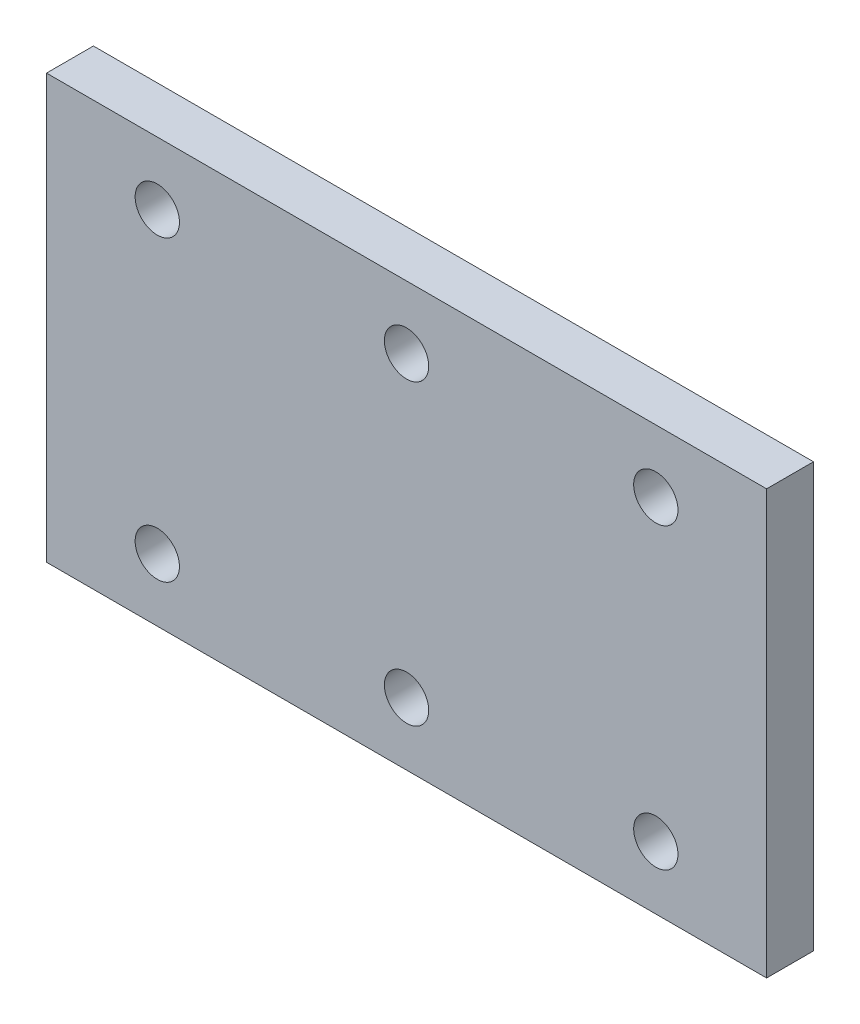
ISO-10303-21;
HEADER;
FILE_DESCRIPTION(('STEP AP214'),'2;1');
FILE_NAME('part.step','',(''),(''),'','','');
FILE_SCHEMA(('AUTOMOTIVE_DESIGN { 1 0 10303 214 1 1 1 1 }'));
ENDSEC;
DATA;
#1=APPLICATION_CONTEXT('core data for automotive mechanical design processes');
#2=APPLICATION_PROTOCOL_DEFINITION('international standard','automotive_design',2000,#1);
#3=PRODUCT_CONTEXT('',#1,'mechanical');
#4=PRODUCT('Part','Part','',(#3));
#5=PRODUCT_RELATED_PRODUCT_CATEGORY('part','',(#4));
#6=PRODUCT_DEFINITION_FORMATION('','',#4);
#7=PRODUCT_DEFINITION_CONTEXT('part definition',#1,'design');
#8=PRODUCT_DEFINITION('design','',#6,#7);
#9=PRODUCT_DEFINITION_SHAPE('','',#8);
#10=(LENGTH_UNIT() NAMED_UNIT(*) SI_UNIT(.MILLI.,.METRE.));
#11=(NAMED_UNIT(*) PLANE_ANGLE_UNIT() SI_UNIT($,.RADIAN.));
#12=(NAMED_UNIT(*) SI_UNIT($,.STERADIAN.) SOLID_ANGLE_UNIT());
#13=UNCERTAINTY_MEASURE_WITH_UNIT(LENGTH_MEASURE(1.E-05),#10,'distance_accuracy_value','');
#14=(GEOMETRIC_REPRESENTATION_CONTEXT(3) GLOBAL_UNCERTAINTY_ASSIGNED_CONTEXT((#13)) GLOBAL_UNIT_ASSIGNED_CONTEXT((#10,
#11,#12)) REPRESENTATION_CONTEXT('',''));
#15=CARTESIAN_POINT('',(0.,0.,0.));
#16=DIRECTION('',(0.,0.,1.));
#17=DIRECTION('',(1.,0.,0.));
#18=AXIS2_PLACEMENT_3D('',#15,#16,#17);
#19=CARTESIAN_POINT('',(48.75,28.68,6.35));
#20=DIRECTION('',(-1.,0.,0.));
#21=DIRECTION('',(0.,0.,1.));
#22=AXIS2_PLACEMENT_3D('',#19,#20,#21);
#23=PLANE('',#22);
#24=DIRECTION('',(0.,1.,0.));
#25=VECTOR('',#24,1.);
#26=CARTESIAN_POINT('',(48.75,28.68,0.));
#27=LINE('',#26,#25);
#28=CARTESIAN_POINT('',(48.75,-28.68,0.));
#29=VERTEX_POINT('',#28);
#30=CARTESIAN_POINT('',(48.75,28.68,0.));
#31=VERTEX_POINT('',#30);
#32=EDGE_CURVE('E104',#29,#31,#27,.T.);
#33=ORIENTED_EDGE('',*,*,#32,.T.);
#34=DIRECTION('',(0.,0.,-1.));
#35=VECTOR('',#34,1.);
#36=CARTESIAN_POINT('',(48.75,28.68,6.35));
#37=LINE('',#36,#35);
#38=CARTESIAN_POINT('',(48.75,28.68,6.35));
#39=VERTEX_POINT('',#38);
#40=EDGE_CURVE('E11',#39,#31,#37,.T.);
#41=ORIENTED_EDGE('',*,*,#40,.F.);
#42=DIRECTION('',(0.,1.,0.));
#43=VECTOR('',#42,1.);
#44=CARTESIAN_POINT('',(48.75,28.68,6.35));
#45=LINE('',#44,#43);
#46=CARTESIAN_POINT('',(48.75,-28.68,6.35));
#47=VERTEX_POINT('',#46);
#48=EDGE_CURVE('E92',#47,#39,#45,.T.);
#49=ORIENTED_EDGE('',*,*,#48,.F.);
#50=DIRECTION('',(0.,0.,-1.));
#51=VECTOR('',#50,1.);
#52=CARTESIAN_POINT('',(48.75,-28.68,6.35));
#53=LINE('',#52,#51);
#54=EDGE_CURVE('E100',#47,#29,#53,.T.);
#55=ORIENTED_EDGE('',*,*,#54,.T.);
#56=EDGE_LOOP('',(#33,#41,#49,#55));
#57=FACE_BOUND('',#56,.T.);
#58=ADVANCED_FACE('F41',(#57),#23,.F.);
#59=CARTESIAN_POINT('',(-48.75,28.68,6.35));
#60=DIRECTION('',(0.,-1.,0.));
#61=DIRECTION('',(0.,0.,-1.));
#62=AXIS2_PLACEMENT_3D('',#59,#60,#61);
#63=PLANE('',#62);
#64=DIRECTION('',(-1.,0.,0.));
#65=VECTOR('',#64,1.);
#66=CARTESIAN_POINT('',(-48.75,28.68,0.));
#67=LINE('',#66,#65);
#68=CARTESIAN_POINT('',(-48.75,28.68,0.));
#69=VERTEX_POINT('',#68);
#70=EDGE_CURVE('E96',#31,#69,#67,.T.);
#71=ORIENTED_EDGE('',*,*,#70,.T.);
#72=DIRECTION('',(0.,0.,-1.));
#73=VECTOR('',#72,1.);
#74=CARTESIAN_POINT('',(-48.75,28.68,6.35));
#75=LINE('',#74,#73);
#76=CARTESIAN_POINT('',(-48.75,28.68,6.35));
#77=VERTEX_POINT('',#76);
#78=EDGE_CURVE('E49',#77,#69,#75,.T.);
#79=ORIENTED_EDGE('',*,*,#78,.F.);
#80=DIRECTION('',(-1.,0.,0.));
#81=VECTOR('',#80,1.);
#82=CARTESIAN_POINT('',(-48.75,28.68,6.35));
#83=LINE('',#82,#81);
#84=EDGE_CURVE('E87',#39,#77,#83,.T.);
#85=ORIENTED_EDGE('',*,*,#84,.F.);
#86=ORIENTED_EDGE('',*,*,#40,.T.);
#87=EDGE_LOOP('',(#71,#79,#85,#86));
#88=FACE_BOUND('',#87,.T.);
#89=ADVANCED_FACE('F95',(#88),#63,.F.);
#90=CARTESIAN_POINT('',(-48.75,28.68,6.35));
#91=DIRECTION('',(1.,0.,0.));
#92=DIRECTION('',(0.,1.,0.));
#93=AXIS2_PLACEMENT_3D('',#90,#91,#92);
#94=PLANE('',#93);
#95=DIRECTION('',(0.,-1.,0.));
#96=VECTOR('',#95,1.);
#97=CARTESIAN_POINT('',(-48.75,28.68,0.));
#98=LINE('',#97,#96);
#99=CARTESIAN_POINT('',(-48.75,-28.68,0.));
#100=VERTEX_POINT('',#99);
#101=EDGE_CURVE('E74',#69,#100,#98,.T.);
#102=ORIENTED_EDGE('',*,*,#101,.T.);
#103=DIRECTION('',(0.,0.,-1.));
#104=VECTOR('',#103,1.);
#105=CARTESIAN_POINT('',(-48.75,-28.68,6.35));
#106=LINE('',#105,#104);
#107=CARTESIAN_POINT('',(-48.75,-28.68,6.35));
#108=VERTEX_POINT('',#107);
#109=EDGE_CURVE('E97',#108,#100,#106,.T.);
#110=ORIENTED_EDGE('',*,*,#109,.F.);
#111=DIRECTION('',(0.,-1.,0.));
#112=VECTOR('',#111,1.);
#113=CARTESIAN_POINT('',(-48.75,28.68,6.35));
#114=LINE('',#113,#112);
#115=EDGE_CURVE('E90',#77,#108,#114,.T.);
#116=ORIENTED_EDGE('',*,*,#115,.F.);
#117=ORIENTED_EDGE('',*,*,#78,.T.);
#118=EDGE_LOOP('',(#102,#110,#116,#117));
#119=FACE_BOUND('',#118,.T.);
#120=ADVANCED_FACE('F98',(#119),#94,.F.);
#121=CARTESIAN_POINT('',(-48.75,-28.68,6.35));
#122=DIRECTION('',(0.,1.,0.));
#123=DIRECTION('',(0.,0.,1.));
#124=AXIS2_PLACEMENT_3D('',#121,#122,#123);
#125=PLANE('',#124);
#126=DIRECTION('',(1.,0.,0.));
#127=VECTOR('',#126,1.);
#128=CARTESIAN_POINT('',(-48.75,-28.68,0.));
#129=LINE('',#128,#127);
#130=EDGE_CURVE('E80',#100,#29,#129,.T.);
#131=ORIENTED_EDGE('',*,*,#130,.T.);
#132=ORIENTED_EDGE('',*,*,#54,.F.);
#133=DIRECTION('',(1.,0.,0.));
#134=VECTOR('',#133,1.);
#135=CARTESIAN_POINT('',(-48.75,-28.68,6.35));
#136=LINE('',#135,#134);
#137=EDGE_CURVE('E57',#108,#47,#136,.T.);
#138=ORIENTED_EDGE('',*,*,#137,.F.);
#139=ORIENTED_EDGE('',*,*,#109,.T.);
#140=EDGE_LOOP('',(#131,#132,#138,#139));
#141=FACE_BOUND('',#140,.T.);
#142=ADVANCED_FACE('F112',(#141),#125,.F.);
#143=CARTESIAN_POINT('',(0.,0.,6.35));
#144=DIRECTION('',(0.,0.,1.));
#145=DIRECTION('',(1.,0.,0.));
#146=AXIS2_PLACEMENT_3D('',#143,#144,#145);
#147=PLANE('',#146);
#148=CARTESIAN_POINT('',(-33.75,-20.18,6.35));
#149=DIRECTION('',(0.,0.,1.));
#150=DIRECTION('',(-1.,0.,0.));
#151=AXIS2_PLACEMENT_3D('',#148,#149,#150);
#152=CIRCLE('',#151,3.00000000000001);
#153=CARTESIAN_POINT('',(-36.75,-20.18,6.35));
#154=VERTEX_POINT('',#153);
#155=EDGE_CURVE('E124',#154,#154,#152,.T.);
#156=ORIENTED_EDGE('',*,*,#155,.F.);
#157=EDGE_LOOP('',(#156));
#158=FACE_BOUND('',#157,.T.);
#159=CARTESIAN_POINT('',(0.,-20.18,6.35));
#160=DIRECTION('',(0.,0.,1.));
#161=DIRECTION('',(-1.,0.,0.));
#162=AXIS2_PLACEMENT_3D('',#159,#160,#161);
#163=CIRCLE('',#162,3.00000000000001);
#164=CARTESIAN_POINT('',(-3.00000000000002,-20.18,6.35));
#165=VERTEX_POINT('',#164);
#166=EDGE_CURVE('E130',#165,#165,#163,.T.);
#167=ORIENTED_EDGE('',*,*,#166,.F.);
#168=EDGE_LOOP('',(#167));
#169=FACE_BOUND('',#168,.T.);
#170=CARTESIAN_POINT('',(33.75,-20.18,6.35));
#171=DIRECTION('',(0.,0.,1.));
#172=DIRECTION('',(-1.,0.,0.));
#173=AXIS2_PLACEMENT_3D('',#170,#171,#172);
#174=CIRCLE('',#173,2.99999999999999);
#175=CARTESIAN_POINT('',(30.75,-20.18,6.35));
#176=VERTEX_POINT('',#175);
#177=EDGE_CURVE('E136',#176,#176,#174,.T.);
#178=ORIENTED_EDGE('',*,*,#177,.F.);
#179=EDGE_LOOP('',(#178));
#180=FACE_BOUND('',#179,.T.);
#181=CARTESIAN_POINT('',(33.75,20.18,6.35));
#182=DIRECTION('',(0.,0.,1.));
#183=DIRECTION('',(1.,0.,0.));
#184=AXIS2_PLACEMENT_3D('',#181,#182,#183);
#185=CIRCLE('',#184,3.00000000000001);
#186=CARTESIAN_POINT('',(36.75,20.18,6.35));
#187=VERTEX_POINT('',#186);
#188=EDGE_CURVE('E142',#187,#187,#185,.T.);
#189=ORIENTED_EDGE('',*,*,#188,.F.);
#190=EDGE_LOOP('',(#189));
#191=FACE_BOUND('',#190,.T.);
#192=CARTESIAN_POINT('',(0.,20.18,6.35));
#193=DIRECTION('',(0.,0.,1.));
#194=DIRECTION('',(1.,0.,0.));
#195=AXIS2_PLACEMENT_3D('',#192,#193,#194);
#196=CIRCLE('',#195,3.00000000000001);
#197=CARTESIAN_POINT('',(2.99999999999999,20.18,6.35));
#198=VERTEX_POINT('',#197);
#199=EDGE_CURVE('E148',#198,#198,#196,.T.);
#200=ORIENTED_EDGE('',*,*,#199,.F.);
#201=EDGE_LOOP('',(#200));
#202=FACE_BOUND('',#201,.T.);
#203=CARTESIAN_POINT('',(-33.75,20.18,6.35));
#204=DIRECTION('',(0.,0.,1.));
#205=DIRECTION('',(1.,0.,0.));
#206=AXIS2_PLACEMENT_3D('',#203,#204,#205);
#207=CIRCLE('',#206,3.00000000000001);
#208=CARTESIAN_POINT('',(-30.75,20.18,6.35));
#209=VERTEX_POINT('',#208);
#210=EDGE_CURVE('E118',#209,#209,#207,.T.);
#211=ORIENTED_EDGE('',*,*,#210,.F.);
#212=EDGE_LOOP('',(#211));
#213=FACE_BOUND('',#212,.T.);
#214=ORIENTED_EDGE('',*,*,#48,.T.);
#215=ORIENTED_EDGE('',*,*,#84,.T.);
#216=ORIENTED_EDGE('',*,*,#115,.T.);
#217=ORIENTED_EDGE('',*,*,#137,.T.);
#218=EDGE_LOOP('',(#214,#215,#216,#217));
#219=FACE_BOUND('',#218,.T.);
#220=ADVANCED_FACE('F88',(#158,#169,#180,#191,#202,#213,#219),#147,.T.);
#221=CARTESIAN_POINT('',(0.,0.,0.));
#222=DIRECTION('',(0.,0.,1.));
#223=DIRECTION('',(1.,0.,0.));
#224=AXIS2_PLACEMENT_3D('',#221,#222,#223);
#225=PLANE('',#224);
#226=CARTESIAN_POINT('',(-33.75,-20.18,0.));
#227=DIRECTION('',(0.,0.,1.));
#228=DIRECTION('',(-1.,0.,0.));
#229=AXIS2_PLACEMENT_3D('',#226,#227,#228);
#230=CIRCLE('',#229,3.00000000000001);
#231=CARTESIAN_POINT('',(-36.75,-20.18,0.));
#232=VERTEX_POINT('',#231);
#233=EDGE_CURVE('E127',#232,#232,#230,.T.);
#234=ORIENTED_EDGE('',*,*,#233,.T.);
#235=EDGE_LOOP('',(#234));
#236=FACE_BOUND('',#235,.T.);
#237=CARTESIAN_POINT('',(0.,-20.18,0.));
#238=DIRECTION('',(0.,0.,1.));
#239=DIRECTION('',(-1.,0.,0.));
#240=AXIS2_PLACEMENT_3D('',#237,#238,#239);
#241=CIRCLE('',#240,3.00000000000001);
#242=CARTESIAN_POINT('',(-3.00000000000002,-20.18,0.));
#243=VERTEX_POINT('',#242);
#244=EDGE_CURVE('E133',#243,#243,#241,.T.);
#245=ORIENTED_EDGE('',*,*,#244,.T.);
#246=EDGE_LOOP('',(#245));
#247=FACE_BOUND('',#246,.T.);
#248=CARTESIAN_POINT('',(33.75,-20.18,0.));
#249=DIRECTION('',(0.,0.,1.));
#250=DIRECTION('',(-1.,0.,0.));
#251=AXIS2_PLACEMENT_3D('',#248,#249,#250);
#252=CIRCLE('',#251,2.99999999999999);
#253=CARTESIAN_POINT('',(30.75,-20.18,0.));
#254=VERTEX_POINT('',#253);
#255=EDGE_CURVE('E139',#254,#254,#252,.T.);
#256=ORIENTED_EDGE('',*,*,#255,.T.);
#257=EDGE_LOOP('',(#256));
#258=FACE_BOUND('',#257,.T.);
#259=CARTESIAN_POINT('',(33.75,20.18,0.));
#260=DIRECTION('',(0.,0.,1.));
#261=DIRECTION('',(1.,0.,0.));
#262=AXIS2_PLACEMENT_3D('',#259,#260,#261);
#263=CIRCLE('',#262,3.00000000000001);
#264=CARTESIAN_POINT('',(36.75,20.18,0.));
#265=VERTEX_POINT('',#264);
#266=EDGE_CURVE('E145',#265,#265,#263,.T.);
#267=ORIENTED_EDGE('',*,*,#266,.T.);
#268=EDGE_LOOP('',(#267));
#269=FACE_BOUND('',#268,.T.);
#270=CARTESIAN_POINT('',(0.,20.18,0.));
#271=DIRECTION('',(0.,0.,1.));
#272=DIRECTION('',(1.,0.,0.));
#273=AXIS2_PLACEMENT_3D('',#270,#271,#272);
#274=CIRCLE('',#273,3.00000000000001);
#275=CARTESIAN_POINT('',(2.99999999999999,20.18,0.));
#276=VERTEX_POINT('',#275);
#277=EDGE_CURVE('E121',#276,#276,#274,.T.);
#278=ORIENTED_EDGE('',*,*,#277,.T.);
#279=EDGE_LOOP('',(#278));
#280=FACE_BOUND('',#279,.T.);
#281=CARTESIAN_POINT('',(-33.75,20.18,0.));
#282=DIRECTION('',(0.,0.,1.));
#283=DIRECTION('',(1.,0.,0.));
#284=AXIS2_PLACEMENT_3D('',#281,#282,#283);
#285=CIRCLE('',#284,3.00000000000001);
#286=CARTESIAN_POINT('',(-30.75,20.18,0.));
#287=VERTEX_POINT('',#286);
#288=EDGE_CURVE('E107',#287,#287,#285,.T.);
#289=ORIENTED_EDGE('',*,*,#288,.T.);
#290=EDGE_LOOP('',(#289));
#291=FACE_BOUND('',#290,.T.);
#292=ORIENTED_EDGE('',*,*,#32,.F.);
#293=ORIENTED_EDGE('',*,*,#130,.F.);
#294=ORIENTED_EDGE('',*,*,#101,.F.);
#295=ORIENTED_EDGE('',*,*,#70,.F.);
#296=EDGE_LOOP('',(#292,#293,#294,#295));
#297=FACE_BOUND('',#296,.T.);
#298=ADVANCED_FACE('F115',(#236,#247,#258,#269,#280,#291,#297),#225,.F.);
#299=CARTESIAN_POINT('',(-33.75,20.18,0.));
#300=DIRECTION('',(0.,0.,1.));
#301=DIRECTION('',(1.,0.,0.));
#302=AXIS2_PLACEMENT_3D('',#299,#300,#301);
#303=CYLINDRICAL_SURFACE('',#302,3.00000000000001);
#304=ORIENTED_EDGE('',*,*,#288,.F.);
#305=EDGE_LOOP('',(#304));
#306=FACE_BOUND('',#305,.T.);
#307=ORIENTED_EDGE('',*,*,#210,.T.);
#308=EDGE_LOOP('',(#307));
#309=FACE_BOUND('',#308,.T.);
#310=ADVANCED_FACE('F160',(#306,#309),#303,.F.);
#311=CARTESIAN_POINT('',(0.,20.18,0.));
#312=DIRECTION('',(0.,0.,1.));
#313=DIRECTION('',(1.,0.,0.));
#314=AXIS2_PLACEMENT_3D('',#311,#312,#313);
#315=CYLINDRICAL_SURFACE('',#314,3.00000000000001);
#316=ORIENTED_EDGE('',*,*,#277,.F.);
#317=EDGE_LOOP('',(#316));
#318=FACE_BOUND('',#317,.T.);
#319=ORIENTED_EDGE('',*,*,#199,.T.);
#320=EDGE_LOOP('',(#319));
#321=FACE_BOUND('',#320,.T.);
#322=ADVANCED_FACE('F156',(#318,#321),#315,.F.);
#323=CARTESIAN_POINT('',(33.75,20.18,0.));
#324=DIRECTION('',(0.,0.,1.));
#325=DIRECTION('',(1.,0.,0.));
#326=AXIS2_PLACEMENT_3D('',#323,#324,#325);
#327=CYLINDRICAL_SURFACE('',#326,3.00000000000001);
#328=ORIENTED_EDGE('',*,*,#266,.F.);
#329=EDGE_LOOP('',(#328));
#330=FACE_BOUND('',#329,.T.);
#331=ORIENTED_EDGE('',*,*,#188,.T.);
#332=EDGE_LOOP('',(#331));
#333=FACE_BOUND('',#332,.T.);
#334=ADVANCED_FACE('F159',(#330,#333),#327,.F.);
#335=CARTESIAN_POINT('',(33.75,-20.18,0.));
#336=DIRECTION('',(0.,0.,1.));
#337=DIRECTION('',(1.,0.,0.));
#338=AXIS2_PLACEMENT_3D('',#335,#336,#337);
#339=CYLINDRICAL_SURFACE('',#338,2.99999999999999);
#340=ORIENTED_EDGE('',*,*,#255,.F.);
#341=EDGE_LOOP('',(#340));
#342=FACE_BOUND('',#341,.T.);
#343=ORIENTED_EDGE('',*,*,#177,.T.);
#344=EDGE_LOOP('',(#343));
#345=FACE_BOUND('',#344,.T.);
#346=ADVANCED_FACE('F224',(#342,#345),#339,.F.);
#347=CARTESIAN_POINT('',(0.,-20.18,0.));
#348=DIRECTION('',(0.,0.,1.));
#349=DIRECTION('',(1.,0.,0.));
#350=AXIS2_PLACEMENT_3D('',#347,#348,#349);
#351=CYLINDRICAL_SURFACE('',#350,3.00000000000001);
#352=ORIENTED_EDGE('',*,*,#244,.F.);
#353=EDGE_LOOP('',(#352));
#354=FACE_BOUND('',#353,.T.);
#355=ORIENTED_EDGE('',*,*,#166,.T.);
#356=EDGE_LOOP('',(#355));
#357=FACE_BOUND('',#356,.T.);
#358=ADVANCED_FACE('F235',(#354,#357),#351,.F.);
#359=CARTESIAN_POINT('',(-33.75,-20.18,0.));
#360=DIRECTION('',(0.,0.,1.));
#361=DIRECTION('',(1.,0.,0.));
#362=AXIS2_PLACEMENT_3D('',#359,#360,#361);
#363=CYLINDRICAL_SURFACE('',#362,3.00000000000001);
#364=ORIENTED_EDGE('',*,*,#233,.F.);
#365=EDGE_LOOP('',(#364));
#366=FACE_BOUND('',#365,.T.);
#367=ORIENTED_EDGE('',*,*,#155,.T.);
#368=EDGE_LOOP('',(#367));
#369=FACE_BOUND('',#368,.T.);
#370=ADVANCED_FACE('F246',(#366,#369),#363,.F.);
#371=CLOSED_SHELL('',(#58,#89,#120,#142,#220,#298,#310,#322,#334,#346,#358,#370));
#372=MANIFOLD_SOLID_BREP('B2',#371);
#373=ADVANCED_BREP_SHAPE_REPRESENTATION('',(#18,#372),#14);
#374=SHAPE_DEFINITION_REPRESENTATION(#9,#373);
ENDSEC;
END-ISO-10303-21;
